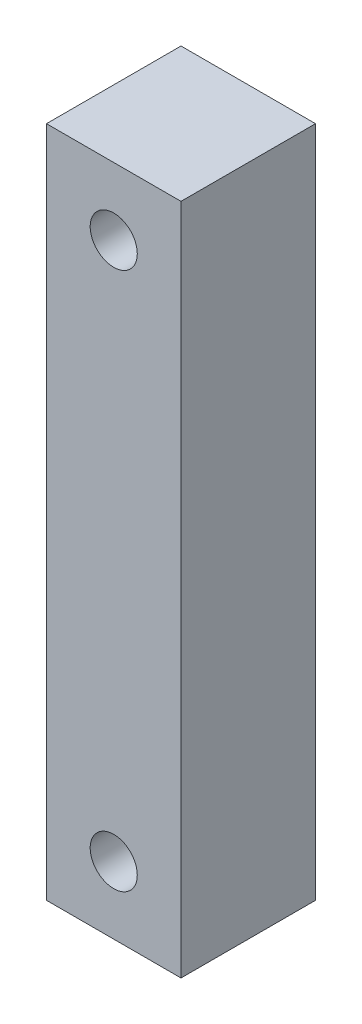
ISO-10303-21;
HEADER;
FILE_DESCRIPTION(('STEP AP214'),'2;1');
FILE_NAME('part.step','',(''),(''),'','','');
FILE_SCHEMA(('AUTOMOTIVE_DESIGN { 1 0 10303 214 1 1 1 1 }'));
ENDSEC;
DATA;
#1=APPLICATION_CONTEXT('core data for automotive mechanical design processes');
#2=APPLICATION_PROTOCOL_DEFINITION('international standard','automotive_design',2000,#1);
#3=PRODUCT_CONTEXT('',#1,'mechanical');
#4=PRODUCT('Part','Part','',(#3));
#5=PRODUCT_RELATED_PRODUCT_CATEGORY('part','',(#4));
#6=PRODUCT_DEFINITION_FORMATION('','',#4);
#7=PRODUCT_DEFINITION_CONTEXT('part definition',#1,'design');
#8=PRODUCT_DEFINITION('design','',#6,#7);
#9=PRODUCT_DEFINITION_SHAPE('','',#8);
#10=(LENGTH_UNIT() NAMED_UNIT(*) SI_UNIT(.MILLI.,.METRE.));
#11=(NAMED_UNIT(*) PLANE_ANGLE_UNIT() SI_UNIT($,.RADIAN.));
#12=(NAMED_UNIT(*) SI_UNIT($,.STERADIAN.) SOLID_ANGLE_UNIT());
#13=UNCERTAINTY_MEASURE_WITH_UNIT(LENGTH_MEASURE(1.E-05),#10,'distance_accuracy_value','');
#14=(GEOMETRIC_REPRESENTATION_CONTEXT(3) GLOBAL_UNCERTAINTY_ASSIGNED_CONTEXT((#13)) GLOBAL_UNIT_ASSIGNED_CONTEXT((#10,
#11,#12)) REPRESENTATION_CONTEXT('',''));
#15=CARTESIAN_POINT('',(0.,0.,0.));
#16=DIRECTION('',(0.,0.,1.));
#17=DIRECTION('',(1.,0.,0.));
#18=AXIS2_PLACEMENT_3D('',#15,#16,#17);
#19=CARTESIAN_POINT('',(5.,50.,5.));
#20=DIRECTION('',(-1.,0.,0.));
#21=DIRECTION('',(0.,0.,1.));
#22=AXIS2_PLACEMENT_3D('',#19,#20,#21);
#23=PLANE('',#22);
#24=DIRECTION('',(0.,0.,-1.));
#25=VECTOR('',#24,1.);
#26=CARTESIAN_POINT('',(5.,0.,5.));
#27=LINE('',#26,#25);
#28=CARTESIAN_POINT('',(5.,0.,5.));
#29=VERTEX_POINT('',#28);
#30=CARTESIAN_POINT('',(5.,0.,-5.));
#31=VERTEX_POINT('',#30);
#32=EDGE_CURVE('E96',#29,#31,#27,.T.);
#33=ORIENTED_EDGE('',*,*,#32,.T.);
#34=DIRECTION('',(0.,-1.,0.));
#35=VECTOR('',#34,1.);
#36=CARTESIAN_POINT('',(5.,50.,-5.));
#37=LINE('',#36,#35);
#38=CARTESIAN_POINT('',(5.,50.,-5.));
#39=VERTEX_POINT('',#38);
#40=EDGE_CURVE('E11',#39,#31,#37,.T.);
#41=ORIENTED_EDGE('',*,*,#40,.F.);
#42=DIRECTION('',(0.,0.,-1.));
#43=VECTOR('',#42,1.);
#44=CARTESIAN_POINT('',(5.,50.,5.));
#45=LINE('',#44,#43);
#46=CARTESIAN_POINT('',(5.,50.,5.));
#47=VERTEX_POINT('',#46);
#48=EDGE_CURVE('E84',#47,#39,#45,.T.);
#49=ORIENTED_EDGE('',*,*,#48,.F.);
#50=DIRECTION('',(0.,-1.,0.));
#51=VECTOR('',#50,1.);
#52=CARTESIAN_POINT('',(5.,50.,5.));
#53=LINE('',#52,#51);
#54=EDGE_CURVE('E92',#47,#29,#53,.T.);
#55=ORIENTED_EDGE('',*,*,#54,.T.);
#56=EDGE_LOOP('',(#33,#41,#49,#55));
#57=FACE_BOUND('',#56,.T.);
#58=ADVANCED_FACE('F33',(#57),#23,.F.);
#59=CARTESIAN_POINT('',(-5.,50.,-5.));
#60=DIRECTION('',(0.,0.,1.));
#61=DIRECTION('',(1.,0.,0.));
#62=AXIS2_PLACEMENT_3D('',#59,#60,#61);
#63=PLANE('',#62);
#64=CARTESIAN_POINT('',(0.,5.,-5.));
#65=DIRECTION('',(0.,0.,1.));
#66=DIRECTION('',(1.,0.,0.));
#67=AXIS2_PLACEMENT_3D('',#64,#65,#66);
#68=CIRCLE('',#67,1.75);
#69=CARTESIAN_POINT('',(1.75,5.,-5.));
#70=VERTEX_POINT('',#69);
#71=EDGE_CURVE('E99',#70,#70,#68,.T.);
#72=ORIENTED_EDGE('',*,*,#71,.T.);
#73=EDGE_LOOP('',(#72));
#74=FACE_BOUND('',#73,.T.);
#75=CARTESIAN_POINT('',(0.,45.,-5.));
#76=DIRECTION('',(0.,0.,1.));
#77=DIRECTION('',(1.,0.,0.));
#78=AXIS2_PLACEMENT_3D('',#75,#76,#77);
#79=CIRCLE('',#78,1.75);
#80=CARTESIAN_POINT('',(1.75,45.,-5.));
#81=VERTEX_POINT('',#80);
#82=EDGE_CURVE('E112',#81,#81,#79,.T.);
#83=ORIENTED_EDGE('',*,*,#82,.T.);
#84=EDGE_LOOP('',(#83));
#85=FACE_BOUND('',#84,.T.);
#86=DIRECTION('',(-1.,0.,0.));
#87=VECTOR('',#86,1.);
#88=CARTESIAN_POINT('',(-5.,0.,-5.));
#89=LINE('',#88,#87);
#90=CARTESIAN_POINT('',(-5.,0.,-5.));
#91=VERTEX_POINT('',#90);
#92=EDGE_CURVE('E88',#31,#91,#89,.T.);
#93=ORIENTED_EDGE('',*,*,#92,.T.);
#94=DIRECTION('',(0.,-1.,0.));
#95=VECTOR('',#94,1.);
#96=CARTESIAN_POINT('',(-5.,50.,-5.));
#97=LINE('',#96,#95);
#98=CARTESIAN_POINT('',(-5.,50.,-5.));
#99=VERTEX_POINT('',#98);
#100=EDGE_CURVE('E41',#99,#91,#97,.T.);
#101=ORIENTED_EDGE('',*,*,#100,.F.);
#102=DIRECTION('',(-1.,0.,0.));
#103=VECTOR('',#102,1.);
#104=CARTESIAN_POINT('',(-5.,50.,-5.));
#105=LINE('',#104,#103);
#106=EDGE_CURVE('E79',#39,#99,#105,.T.);
#107=ORIENTED_EDGE('',*,*,#106,.F.);
#108=ORIENTED_EDGE('',*,*,#40,.T.);
#109=EDGE_LOOP('',(#93,#101,#107,#108));
#110=FACE_BOUND('',#109,.T.);
#111=ADVANCED_FACE('F87',(#74,#85,#110),#63,.F.);
#112=CARTESIAN_POINT('',(-5.,50.,5.));
#113=DIRECTION('',(1.,0.,0.));
#114=DIRECTION('',(0.,0.,-1.));
#115=AXIS2_PLACEMENT_3D('',#112,#113,#114);
#116=PLANE('',#115);
#117=DIRECTION('',(0.,0.,1.));
#118=VECTOR('',#117,1.);
#119=CARTESIAN_POINT('',(-5.,0.,5.));
#120=LINE('',#119,#118);
#121=CARTESIAN_POINT('',(-5.,0.,5.));
#122=VERTEX_POINT('',#121);
#123=EDGE_CURVE('E66',#91,#122,#120,.T.);
#124=ORIENTED_EDGE('',*,*,#123,.T.);
#125=DIRECTION('',(0.,-1.,0.));
#126=VECTOR('',#125,1.);
#127=CARTESIAN_POINT('',(-5.,50.,5.));
#128=LINE('',#127,#126);
#129=CARTESIAN_POINT('',(-5.,50.,5.));
#130=VERTEX_POINT('',#129);
#131=EDGE_CURVE('E89',#130,#122,#128,.T.);
#132=ORIENTED_EDGE('',*,*,#131,.F.);
#133=DIRECTION('',(0.,0.,1.));
#134=VECTOR('',#133,1.);
#135=CARTESIAN_POINT('',(-5.,50.,5.));
#136=LINE('',#135,#134);
#137=EDGE_CURVE('E82',#99,#130,#136,.T.);
#138=ORIENTED_EDGE('',*,*,#137,.F.);
#139=ORIENTED_EDGE('',*,*,#100,.T.);
#140=EDGE_LOOP('',(#124,#132,#138,#139));
#141=FACE_BOUND('',#140,.T.);
#142=ADVANCED_FACE('F90',(#141),#116,.F.);
#143=CARTESIAN_POINT('',(-5.,50.,5.));
#144=DIRECTION('',(0.,0.,-1.));
#145=DIRECTION('',(-1.,0.,0.));
#146=AXIS2_PLACEMENT_3D('',#143,#144,#145);
#147=PLANE('',#146);
#148=CARTESIAN_POINT('',(0.,5.,5.));
#149=DIRECTION('',(0.,0.,1.));
#150=DIRECTION('',(1.,0.,0.));
#151=AXIS2_PLACEMENT_3D('',#148,#149,#150);
#152=CIRCLE('',#151,1.75);
#153=CARTESIAN_POINT('',(1.75,5.,5.));
#154=VERTEX_POINT('',#153);
#155=EDGE_CURVE('E115',#154,#154,#152,.T.);
#156=ORIENTED_EDGE('',*,*,#155,.F.);
#157=EDGE_LOOP('',(#156));
#158=FACE_BOUND('',#157,.T.);
#159=CARTESIAN_POINT('',(0.,45.,5.));
#160=DIRECTION('',(0.,0.,1.));
#161=DIRECTION('',(1.,0.,0.));
#162=AXIS2_PLACEMENT_3D('',#159,#160,#161);
#163=CIRCLE('',#162,1.75);
#164=CARTESIAN_POINT('',(1.75,45.,5.));
#165=VERTEX_POINT('',#164);
#166=EDGE_CURVE('E116',#165,#165,#163,.T.);
#167=ORIENTED_EDGE('',*,*,#166,.F.);
#168=EDGE_LOOP('',(#167));
#169=FACE_BOUND('',#168,.T.);
#170=DIRECTION('',(1.,0.,0.));
#171=VECTOR('',#170,1.);
#172=CARTESIAN_POINT('',(-5.,0.,5.));
#173=LINE('',#172,#171);
#174=EDGE_CURVE('E72',#122,#29,#173,.T.);
#175=ORIENTED_EDGE('',*,*,#174,.T.);
#176=ORIENTED_EDGE('',*,*,#54,.F.);
#177=DIRECTION('',(1.,0.,0.));
#178=VECTOR('',#177,1.);
#179=CARTESIAN_POINT('',(-5.,50.,5.));
#180=LINE('',#179,#178);
#181=EDGE_CURVE('E49',#130,#47,#180,.T.);
#182=ORIENTED_EDGE('',*,*,#181,.F.);
#183=ORIENTED_EDGE('',*,*,#131,.T.);
#184=EDGE_LOOP('',(#175,#176,#182,#183));
#185=FACE_BOUND('',#184,.T.);
#186=ADVANCED_FACE('F104',(#158,#169,#185),#147,.F.);
#187=CARTESIAN_POINT('',(0.,50.,0.));
#188=DIRECTION('',(0.,-1.,0.));
#189=DIRECTION('',(0.,0.,-1.));
#190=AXIS2_PLACEMENT_3D('',#187,#188,#189);
#191=PLANE('',#190);
#192=ORIENTED_EDGE('',*,*,#48,.T.);
#193=ORIENTED_EDGE('',*,*,#106,.T.);
#194=ORIENTED_EDGE('',*,*,#137,.T.);
#195=ORIENTED_EDGE('',*,*,#181,.T.);
#196=EDGE_LOOP('',(#192,#193,#194,#195));
#197=FACE_BOUND('',#196,.T.);
#198=ADVANCED_FACE('F80',(#197),#191,.F.);
#199=CARTESIAN_POINT('',(0.,0.,0.));
#200=DIRECTION('',(0.,-1.,0.));
#201=DIRECTION('',(0.,0.,-1.));
#202=AXIS2_PLACEMENT_3D('',#199,#200,#201);
#203=PLANE('',#202);
#204=ORIENTED_EDGE('',*,*,#32,.F.);
#205=ORIENTED_EDGE('',*,*,#174,.F.);
#206=ORIENTED_EDGE('',*,*,#123,.F.);
#207=ORIENTED_EDGE('',*,*,#92,.F.);
#208=EDGE_LOOP('',(#204,#205,#206,#207));
#209=FACE_BOUND('',#208,.T.);
#210=ADVANCED_FACE('F107',(#209),#203,.T.);
#211=CARTESIAN_POINT('',(0.,45.,-9.));
#212=DIRECTION('',(0.,0.,1.));
#213=DIRECTION('',(1.,0.,0.));
#214=AXIS2_PLACEMENT_3D('',#211,#212,#213);
#215=CYLINDRICAL_SURFACE('',#214,1.75);
#216=ORIENTED_EDGE('',*,*,#166,.T.);
#217=EDGE_LOOP('',(#216));
#218=FACE_BOUND('',#217,.T.);
#219=ORIENTED_EDGE('',*,*,#82,.F.);
#220=EDGE_LOOP('',(#219));
#221=FACE_BOUND('',#220,.T.);
#222=ADVANCED_FACE('F130',(#218,#221),#215,.F.);
#223=CARTESIAN_POINT('',(0.,5.,-9.));
#224=DIRECTION('',(0.,0.,1.));
#225=DIRECTION('',(1.,0.,0.));
#226=AXIS2_PLACEMENT_3D('',#223,#224,#225);
#227=CYLINDRICAL_SURFACE('',#226,1.75);
#228=ORIENTED_EDGE('',*,*,#155,.T.);
#229=EDGE_LOOP('',(#228));
#230=FACE_BOUND('',#229,.T.);
#231=ORIENTED_EDGE('',*,*,#71,.F.);
#232=EDGE_LOOP('',(#231));
#233=FACE_BOUND('',#232,.T.);
#234=ADVANCED_FACE('F122',(#230,#233),#227,.F.);
#235=CLOSED_SHELL('',(#58,#111,#142,#186,#198,#210,#222,#234));
#236=MANIFOLD_SOLID_BREP('B2',#235);
#237=ADVANCED_BREP_SHAPE_REPRESENTATION('',(#18,#236),#14);
#238=SHAPE_DEFINITION_REPRESENTATION(#9,#237);
ENDSEC;
END-ISO-10303-21;
